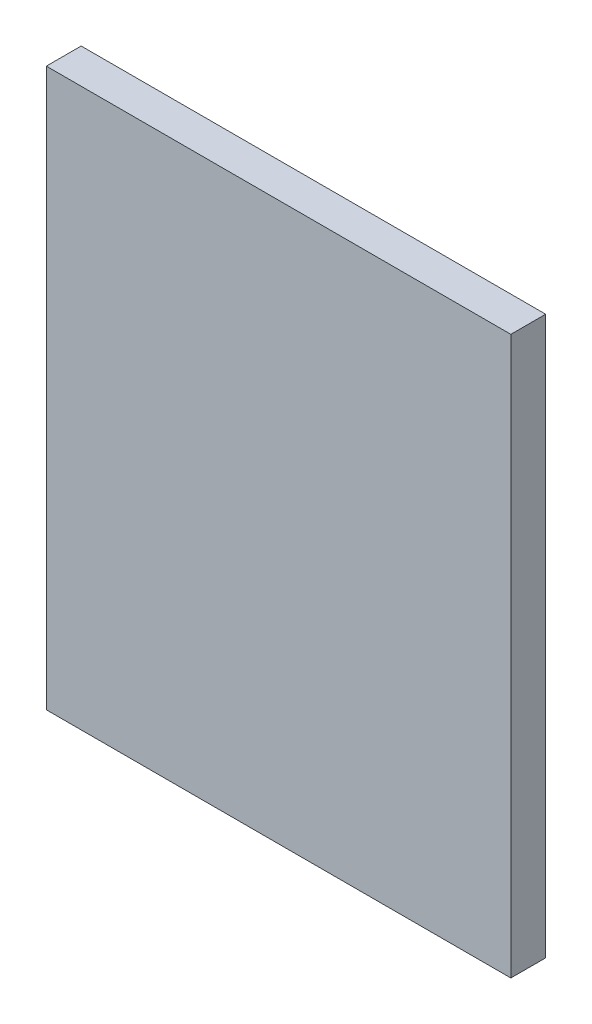
ISO-10303-21;
HEADER;
FILE_DESCRIPTION(('STEP AP214'),'2;1');
FILE_NAME('part.step','',(''),(''),'','','');
FILE_SCHEMA(('AUTOMOTIVE_DESIGN { 1 0 10303 214 1 1 1 1 }'));
ENDSEC;
DATA;
#1=APPLICATION_CONTEXT('core data for automotive mechanical design processes');
#2=APPLICATION_PROTOCOL_DEFINITION('international standard','automotive_design',2000,#1);
#3=PRODUCT_CONTEXT('',#1,'mechanical');
#4=PRODUCT('Part','Part','',(#3));
#5=PRODUCT_RELATED_PRODUCT_CATEGORY('part','',(#4));
#6=PRODUCT_DEFINITION_FORMATION('','',#4);
#7=PRODUCT_DEFINITION_CONTEXT('part definition',#1,'design');
#8=PRODUCT_DEFINITION('design','',#6,#7);
#9=PRODUCT_DEFINITION_SHAPE('','',#8);
#10=(LENGTH_UNIT() NAMED_UNIT(*) SI_UNIT(.MILLI.,.METRE.));
#11=(NAMED_UNIT(*) PLANE_ANGLE_UNIT() SI_UNIT($,.RADIAN.));
#12=(NAMED_UNIT(*) SI_UNIT($,.STERADIAN.) SOLID_ANGLE_UNIT());
#13=UNCERTAINTY_MEASURE_WITH_UNIT(LENGTH_MEASURE(1.E-05),#10,'distance_accuracy_value','');
#14=(GEOMETRIC_REPRESENTATION_CONTEXT(3) GLOBAL_UNCERTAINTY_ASSIGNED_CONTEXT((#13)) GLOBAL_UNIT_ASSIGNED_CONTEXT((#10,
#11,#12)) REPRESENTATION_CONTEXT('',''));
#15=CARTESIAN_POINT('',(0.,0.,0.));
#16=DIRECTION('',(0.,0.,1.));
#17=DIRECTION('',(1.,0.,0.));
#18=AXIS2_PLACEMENT_3D('',#15,#16,#17);
#19=CARTESIAN_POINT('',(0.,0.,9.525));
#20=DIRECTION('',(1.,0.,0.));
#21=DIRECTION('',(0.,0.,-1.));
#22=AXIS2_PLACEMENT_3D('',#19,#20,#21);
#23=PLANE('',#22);
#24=DIRECTION('',(0.,-1.,0.));
#25=VECTOR('',#24,1.);
#26=CARTESIAN_POINT('',(0.,0.,0.));
#27=LINE('',#26,#25);
#28=CARTESIAN_POINT('',(0.,152.4,0.));
#29=VERTEX_POINT('',#28);
#30=CARTESIAN_POINT('',(0.,0.,0.));
#31=VERTEX_POINT('',#30);
#32=EDGE_CURVE('E96',#29,#31,#27,.T.);
#33=ORIENTED_EDGE('',*,*,#32,.T.);
#34=DIRECTION('',(0.,0.,-1.));
#35=VECTOR('',#34,1.);
#36=CARTESIAN_POINT('',(0.,0.,9.525));
#37=LINE('',#36,#35);
#38=CARTESIAN_POINT('',(0.,0.,9.525));
#39=VERTEX_POINT('',#38);
#40=EDGE_CURVE('E11',#39,#31,#37,.T.);
#41=ORIENTED_EDGE('',*,*,#40,.F.);
#42=DIRECTION('',(0.,-1.,0.));
#43=VECTOR('',#42,1.);
#44=CARTESIAN_POINT('',(0.,0.,9.525));
#45=LINE('',#44,#43);
#46=CARTESIAN_POINT('',(0.,152.4,9.525));
#47=VERTEX_POINT('',#46);
#48=EDGE_CURVE('E84',#47,#39,#45,.T.);
#49=ORIENTED_EDGE('',*,*,#48,.F.);
#50=DIRECTION('',(0.,0.,-1.));
#51=VECTOR('',#50,1.);
#52=CARTESIAN_POINT('',(0.,152.4,9.525));
#53=LINE('',#52,#51);
#54=EDGE_CURVE('E92',#47,#29,#53,.T.);
#55=ORIENTED_EDGE('',*,*,#54,.T.);
#56=EDGE_LOOP('',(#33,#41,#49,#55));
#57=FACE_BOUND('',#56,.T.);
#58=ADVANCED_FACE('F33',(#57),#23,.F.);
#59=CARTESIAN_POINT('',(0.,0.,9.525));
#60=DIRECTION('',(0.,1.,0.));
#61=DIRECTION('',(0.,0.,1.));
#62=AXIS2_PLACEMENT_3D('',#59,#60,#61);
#63=PLANE('',#62);
#64=DIRECTION('',(1.,0.,0.));
#65=VECTOR('',#64,1.);
#66=CARTESIAN_POINT('',(0.,0.,0.));
#67=LINE('',#66,#65);
#68=CARTESIAN_POINT('',(127.,0.,0.));
#69=VERTEX_POINT('',#68);
#70=EDGE_CURVE('E88',#31,#69,#67,.T.);
#71=ORIENTED_EDGE('',*,*,#70,.T.);
#72=DIRECTION('',(0.,0.,-1.));
#73=VECTOR('',#72,1.);
#74=CARTESIAN_POINT('',(127.,0.,9.525));
#75=LINE('',#74,#73);
#76=CARTESIAN_POINT('',(127.,0.,9.525));
#77=VERTEX_POINT('',#76);
#78=EDGE_CURVE('E41',#77,#69,#75,.T.);
#79=ORIENTED_EDGE('',*,*,#78,.F.);
#80=DIRECTION('',(1.,0.,0.));
#81=VECTOR('',#80,1.);
#82=CARTESIAN_POINT('',(0.,0.,9.525));
#83=LINE('',#82,#81);
#84=EDGE_CURVE('E79',#39,#77,#83,.T.);
#85=ORIENTED_EDGE('',*,*,#84,.F.);
#86=ORIENTED_EDGE('',*,*,#40,.T.);
#87=EDGE_LOOP('',(#71,#79,#85,#86));
#88=FACE_BOUND('',#87,.T.);
#89=ADVANCED_FACE('F87',(#88),#63,.F.);
#90=CARTESIAN_POINT('',(127.,0.,9.525));
#91=DIRECTION('',(-1.,0.,0.));
#92=DIRECTION('',(0.,0.,1.));
#93=AXIS2_PLACEMENT_3D('',#90,#91,#92);
#94=PLANE('',#93);
#95=DIRECTION('',(0.,1.,0.));
#96=VECTOR('',#95,1.);
#97=CARTESIAN_POINT('',(127.,0.,0.));
#98=LINE('',#97,#96);
#99=CARTESIAN_POINT('',(127.,152.4,0.));
#100=VERTEX_POINT('',#99);
#101=EDGE_CURVE('E66',#69,#100,#98,.T.);
#102=ORIENTED_EDGE('',*,*,#101,.T.);
#103=DIRECTION('',(0.,0.,-1.));
#104=VECTOR('',#103,1.);
#105=CARTESIAN_POINT('',(127.,152.4,9.525));
#106=LINE('',#105,#104);
#107=CARTESIAN_POINT('',(127.,152.4,9.525));
#108=VERTEX_POINT('',#107);
#109=EDGE_CURVE('E89',#108,#100,#106,.T.);
#110=ORIENTED_EDGE('',*,*,#109,.F.);
#111=DIRECTION('',(0.,1.,0.));
#112=VECTOR('',#111,1.);
#113=CARTESIAN_POINT('',(127.,0.,9.525));
#114=LINE('',#113,#112);
#115=EDGE_CURVE('E82',#77,#108,#114,.T.);
#116=ORIENTED_EDGE('',*,*,#115,.F.);
#117=ORIENTED_EDGE('',*,*,#78,.T.);
#118=EDGE_LOOP('',(#102,#110,#116,#117));
#119=FACE_BOUND('',#118,.T.);
#120=ADVANCED_FACE('F90',(#119),#94,.F.);
#121=CARTESIAN_POINT('',(0.,152.4,9.525));
#122=DIRECTION('',(0.,-1.,0.));
#123=DIRECTION('',(0.,0.,-1.));
#124=AXIS2_PLACEMENT_3D('',#121,#122,#123);
#125=PLANE('',#124);
#126=DIRECTION('',(-1.,0.,0.));
#127=VECTOR('',#126,1.);
#128=CARTESIAN_POINT('',(0.,152.4,0.));
#129=LINE('',#128,#127);
#130=EDGE_CURVE('E72',#100,#29,#129,.T.);
#131=ORIENTED_EDGE('',*,*,#130,.T.);
#132=ORIENTED_EDGE('',*,*,#54,.F.);
#133=DIRECTION('',(-1.,0.,0.));
#134=VECTOR('',#133,1.);
#135=CARTESIAN_POINT('',(0.,152.4,9.525));
#136=LINE('',#135,#134);
#137=EDGE_CURVE('E49',#108,#47,#136,.T.);
#138=ORIENTED_EDGE('',*,*,#137,.F.);
#139=ORIENTED_EDGE('',*,*,#109,.T.);
#140=EDGE_LOOP('',(#131,#132,#138,#139));
#141=FACE_BOUND('',#140,.T.);
#142=ADVANCED_FACE('F103',(#141),#125,.F.);
#143=CARTESIAN_POINT('',(0.,0.,9.525));
#144=DIRECTION('',(0.,0.,-1.));
#145=DIRECTION('',(-1.,0.,0.));
#146=AXIS2_PLACEMENT_3D('',#143,#144,#145);
#147=PLANE('',#146);
#148=ORIENTED_EDGE('',*,*,#48,.T.);
#149=ORIENTED_EDGE('',*,*,#84,.T.);
#150=ORIENTED_EDGE('',*,*,#115,.T.);
#151=ORIENTED_EDGE('',*,*,#137,.T.);
#152=EDGE_LOOP('',(#148,#149,#150,#151));
#153=FACE_BOUND('',#152,.T.);
#154=ADVANCED_FACE('F80',(#153),#147,.F.);
#155=CARTESIAN_POINT('',(0.,0.,0.));
#156=DIRECTION('',(0.,0.,-1.));
#157=DIRECTION('',(-1.,0.,0.));
#158=AXIS2_PLACEMENT_3D('',#155,#156,#157);
#159=PLANE('',#158);
#160=ORIENTED_EDGE('',*,*,#32,.F.);
#161=ORIENTED_EDGE('',*,*,#130,.F.);
#162=ORIENTED_EDGE('',*,*,#101,.F.);
#163=ORIENTED_EDGE('',*,*,#70,.F.);
#164=EDGE_LOOP('',(#160,#161,#162,#163));
#165=FACE_BOUND('',#164,.T.);
#166=ADVANCED_FACE('F106',(#165),#159,.T.);
#167=CLOSED_SHELL('',(#58,#89,#120,#142,#154,#166));
#168=MANIFOLD_SOLID_BREP('B2',#167);
#169=ADVANCED_BREP_SHAPE_REPRESENTATION('',(#18,#168),#14);
#170=SHAPE_DEFINITION_REPRESENTATION(#9,#169);
ENDSEC;
END-ISO-10303-21;
